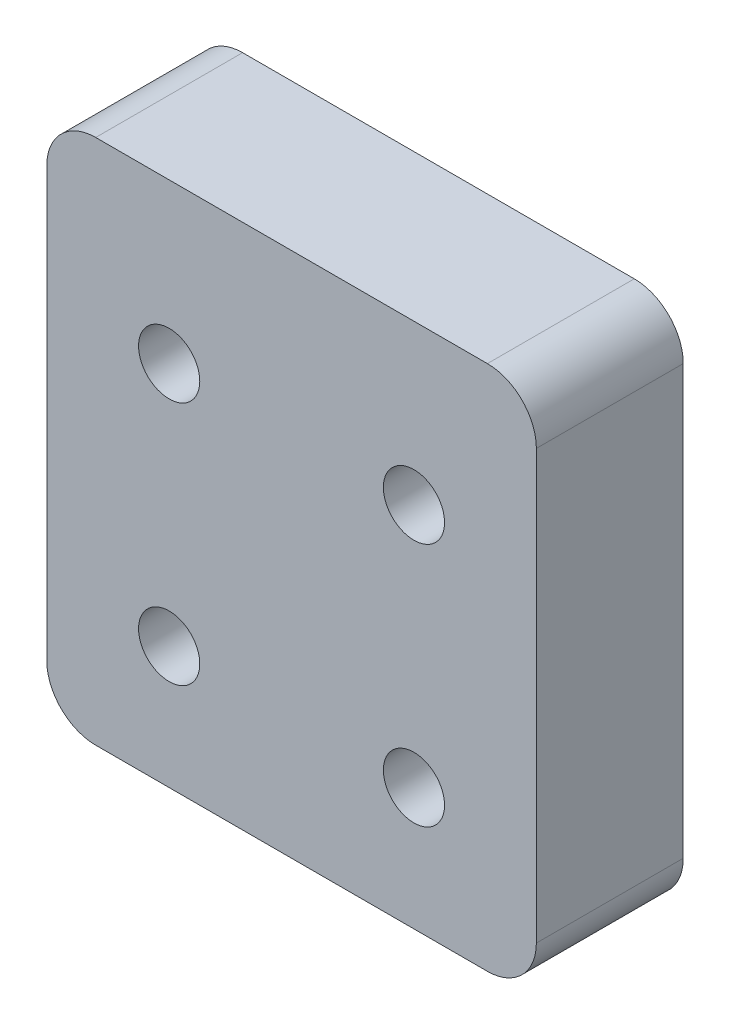
ISO-10303-21;
HEADER;
FILE_DESCRIPTION(('STEP AP214'),'2;1');
FILE_NAME('part.step','',(''),(''),'','','');
FILE_SCHEMA(('AUTOMOTIVE_DESIGN { 1 0 10303 214 1 1 1 1 }'));
ENDSEC;
DATA;
#1=APPLICATION_CONTEXT('core data for automotive mechanical design processes');
#2=APPLICATION_PROTOCOL_DEFINITION('international standard','automotive_design',2000,#1);
#3=PRODUCT_CONTEXT('',#1,'mechanical');
#4=PRODUCT('Part','Part','',(#3));
#5=PRODUCT_RELATED_PRODUCT_CATEGORY('part','',(#4));
#6=PRODUCT_DEFINITION_FORMATION('','',#4);
#7=PRODUCT_DEFINITION_CONTEXT('part definition',#1,'design');
#8=PRODUCT_DEFINITION('design','',#6,#7);
#9=PRODUCT_DEFINITION_SHAPE('','',#8);
#10=(LENGTH_UNIT() NAMED_UNIT(*) SI_UNIT(.MILLI.,.METRE.));
#11=(NAMED_UNIT(*) PLANE_ANGLE_UNIT() SI_UNIT($,.RADIAN.));
#12=(NAMED_UNIT(*) SI_UNIT($,.STERADIAN.) SOLID_ANGLE_UNIT());
#13=UNCERTAINTY_MEASURE_WITH_UNIT(LENGTH_MEASURE(1.E-05),#10,'distance_accuracy_value','');
#14=(GEOMETRIC_REPRESENTATION_CONTEXT(3) GLOBAL_UNCERTAINTY_ASSIGNED_CONTEXT((#13)) GLOBAL_UNIT_ASSIGNED_CONTEXT((#10,
#11,#12)) REPRESENTATION_CONTEXT('',''));
#15=CARTESIAN_POINT('',(0.,0.,0.));
#16=DIRECTION('',(0.,0.,1.));
#17=DIRECTION('',(1.,0.,0.));
#18=AXIS2_PLACEMENT_3D('',#15,#16,#17);
#19=CARTESIAN_POINT('',(0.,0.,12.));
#20=DIRECTION('',(1.,0.,0.));
#21=DIRECTION('',(0.,0.,-1.));
#22=AXIS2_PLACEMENT_3D('',#19,#20,#21);
#23=PLANE('',#22);
#24=DIRECTION('',(0.,-1.,0.));
#25=VECTOR('',#24,1.);
#26=CARTESIAN_POINT('',(0.,0.,0.));
#27=LINE('',#26,#25);
#28=CARTESIAN_POINT('',(0.,39.,0.));
#29=VERTEX_POINT('',#28);
#30=CARTESIAN_POINT('',(0.,4.,0.));
#31=VERTEX_POINT('',#30);
#32=EDGE_CURVE('E157',#29,#31,#27,.T.);
#33=ORIENTED_EDGE('',*,*,#32,.T.);
#34=DIRECTION('',(0.,0.,-1.));
#35=VECTOR('',#34,1.);
#36=CARTESIAN_POINT('',(0.,4.,12.));
#37=LINE('',#36,#35);
#38=CARTESIAN_POINT('',(0.,4.,12.));
#39=VERTEX_POINT('',#38);
#40=EDGE_CURVE('E11',#31,#39,#37,.F.);
#41=ORIENTED_EDGE('',*,*,#40,.T.);
#42=DIRECTION('',(0.,-1.,0.));
#43=VECTOR('',#42,1.);
#44=CARTESIAN_POINT('',(0.,0.,12.));
#45=LINE('',#44,#43);
#46=CARTESIAN_POINT('',(0.,39.,12.));
#47=VERTEX_POINT('',#46);
#48=EDGE_CURVE('E125',#47,#39,#45,.T.);
#49=ORIENTED_EDGE('',*,*,#48,.F.);
#50=DIRECTION('',(0.,0.,-1.));
#51=VECTOR('',#50,1.);
#52=CARTESIAN_POINT('',(0.,39.,12.));
#53=LINE('',#52,#51);
#54=EDGE_CURVE('E41',#47,#29,#53,.T.);
#55=ORIENTED_EDGE('',*,*,#54,.T.);
#56=EDGE_LOOP('',(#33,#41,#49,#55));
#57=FACE_BOUND('',#56,.T.);
#58=ADVANCED_FACE('F33',(#57),#23,.F.);
#59=CARTESIAN_POINT('',(0.,0.,12.));
#60=DIRECTION('',(0.,1.,0.));
#61=DIRECTION('',(0.,0.,1.));
#62=AXIS2_PLACEMENT_3D('',#59,#60,#61);
#63=PLANE('',#62);
#64=DIRECTION('',(1.,0.,0.));
#65=VECTOR('',#64,1.);
#66=CARTESIAN_POINT('',(0.,0.,0.));
#67=LINE('',#66,#65);
#68=CARTESIAN_POINT('',(4.,0.,0.));
#69=VERTEX_POINT('',#68);
#70=CARTESIAN_POINT('',(36.,0.,0.));
#71=VERTEX_POINT('',#70);
#72=EDGE_CURVE('E130',#69,#71,#67,.T.);
#73=ORIENTED_EDGE('',*,*,#72,.T.);
#74=DIRECTION('',(0.,0.,-1.));
#75=VECTOR('',#74,1.);
#76=CARTESIAN_POINT('',(36.,0.,12.));
#77=LINE('',#76,#75);
#78=CARTESIAN_POINT('',(36.,0.,12.));
#79=VERTEX_POINT('',#78);
#80=EDGE_CURVE('E48',#71,#79,#77,.F.);
#81=ORIENTED_EDGE('',*,*,#80,.T.);
#82=DIRECTION('',(1.,0.,0.));
#83=VECTOR('',#82,1.);
#84=CARTESIAN_POINT('',(0.,0.,12.));
#85=LINE('',#84,#83);
#86=CARTESIAN_POINT('',(4.,0.,12.));
#87=VERTEX_POINT('',#86);
#88=EDGE_CURVE('E128',#87,#79,#85,.T.);
#89=ORIENTED_EDGE('',*,*,#88,.F.);
#90=DIRECTION('',(0.,0.,-1.));
#91=VECTOR('',#90,1.);
#92=CARTESIAN_POINT('',(4.,0.,12.));
#93=LINE('',#92,#91);
#94=EDGE_CURVE('E149',#87,#69,#93,.T.);
#95=ORIENTED_EDGE('',*,*,#94,.T.);
#96=EDGE_LOOP('',(#73,#81,#89,#95));
#97=FACE_BOUND('',#96,.T.);
#98=ADVANCED_FACE('F219',(#97),#63,.F.);
#99=CARTESIAN_POINT('',(40.,0.,12.));
#100=DIRECTION('',(-1.,0.,0.));
#101=DIRECTION('',(0.,0.,1.));
#102=AXIS2_PLACEMENT_3D('',#99,#100,#101);
#103=PLANE('',#102);
#104=DIRECTION('',(0.,1.,0.));
#105=VECTOR('',#104,1.);
#106=CARTESIAN_POINT('',(40.,0.,0.));
#107=LINE('',#106,#105);
#108=CARTESIAN_POINT('',(40.,4.,0.));
#109=VERTEX_POINT('',#108);
#110=CARTESIAN_POINT('',(40.,39.,0.));
#111=VERTEX_POINT('',#110);
#112=EDGE_CURVE('E126',#109,#111,#107,.T.);
#113=ORIENTED_EDGE('',*,*,#112,.T.);
#114=DIRECTION('',(0.,0.,-1.));
#115=VECTOR('',#114,1.);
#116=CARTESIAN_POINT('',(40.,39.,12.));
#117=LINE('',#116,#115);
#118=CARTESIAN_POINT('',(40.,39.,12.));
#119=VERTEX_POINT('',#118);
#120=EDGE_CURVE('E104',#111,#119,#117,.F.);
#121=ORIENTED_EDGE('',*,*,#120,.T.);
#122=DIRECTION('',(0.,1.,0.));
#123=VECTOR('',#122,1.);
#124=CARTESIAN_POINT('',(40.,0.,12.));
#125=LINE('',#124,#123);
#126=CARTESIAN_POINT('',(40.,4.,12.));
#127=VERTEX_POINT('',#126);
#128=EDGE_CURVE('E169',#127,#119,#125,.T.);
#129=ORIENTED_EDGE('',*,*,#128,.F.);
#130=DIRECTION('',(0.,0.,-1.));
#131=VECTOR('',#130,1.);
#132=CARTESIAN_POINT('',(40.,4.,12.));
#133=LINE('',#132,#131);
#134=EDGE_CURVE('E109',#127,#109,#133,.T.);
#135=ORIENTED_EDGE('',*,*,#134,.T.);
#136=EDGE_LOOP('',(#113,#121,#129,#135));
#137=FACE_BOUND('',#136,.T.);
#138=ADVANCED_FACE('F216',(#137),#103,.F.);
#139=CARTESIAN_POINT('',(0.,43.,12.));
#140=DIRECTION('',(0.,-1.,0.));
#141=DIRECTION('',(0.,0.,-1.));
#142=AXIS2_PLACEMENT_3D('',#139,#140,#141);
#143=PLANE('',#142);
#144=DIRECTION('',(-1.,0.,0.));
#145=VECTOR('',#144,1.);
#146=CARTESIAN_POINT('',(0.,43.,12.));
#147=LINE('',#146,#145);
#148=CARTESIAN_POINT('',(36.,43.,12.));
#149=VERTEX_POINT('',#148);
#150=CARTESIAN_POINT('',(4.,43.,12.));
#151=VERTEX_POINT('',#150);
#152=EDGE_CURVE('E119',#149,#151,#147,.T.);
#153=ORIENTED_EDGE('',*,*,#152,.F.);
#154=DIRECTION('',(0.,0.,-1.));
#155=VECTOR('',#154,1.);
#156=CARTESIAN_POINT('',(36.,43.,12.));
#157=LINE('',#156,#155);
#158=CARTESIAN_POINT('',(36.,43.,0.));
#159=VERTEX_POINT('',#158);
#160=EDGE_CURVE('E103',#149,#159,#157,.T.);
#161=ORIENTED_EDGE('',*,*,#160,.T.);
#162=DIRECTION('',(-1.,0.,0.));
#163=VECTOR('',#162,1.);
#164=CARTESIAN_POINT('',(0.,43.,0.));
#165=LINE('',#164,#163);
#166=CARTESIAN_POINT('',(4.,43.,0.));
#167=VERTEX_POINT('',#166);
#168=EDGE_CURVE('E116',#159,#167,#165,.T.);
#169=ORIENTED_EDGE('',*,*,#168,.T.);
#170=DIRECTION('',(0.,0.,-1.));
#171=VECTOR('',#170,1.);
#172=CARTESIAN_POINT('',(4.,43.,12.));
#173=LINE('',#172,#171);
#174=EDGE_CURVE('E121',#167,#151,#173,.F.);
#175=ORIENTED_EDGE('',*,*,#174,.T.);
#176=EDGE_LOOP('',(#153,#161,#169,#175));
#177=FACE_BOUND('',#176,.T.);
#178=ADVANCED_FACE('F115',(#177),#143,.F.);
#179=CARTESIAN_POINT('',(0.,0.,12.));
#180=DIRECTION('',(0.,0.,-1.));
#181=DIRECTION('',(-1.,0.,0.));
#182=AXIS2_PLACEMENT_3D('',#179,#180,#181);
#183=PLANE('',#182);
#184=CARTESIAN_POINT('',(10.,10.,12.));
#185=DIRECTION('',(0.,0.,1.));
#186=DIRECTION('',(-1.,0.,0.));
#187=AXIS2_PLACEMENT_3D('',#184,#185,#186);
#188=CIRCLE('',#187,2.5);
#189=CARTESIAN_POINT('',(7.5,10.,12.));
#190=VERTEX_POINT('',#189);
#191=EDGE_CURVE('E188',#190,#190,#188,.T.);
#192=ORIENTED_EDGE('',*,*,#191,.F.);
#193=EDGE_LOOP('',(#192));
#194=FACE_BOUND('',#193,.T.);
#195=CARTESIAN_POINT('',(30.,10.,12.));
#196=DIRECTION('',(0.,0.,1.));
#197=DIRECTION('',(1.,0.,0.));
#198=AXIS2_PLACEMENT_3D('',#195,#196,#197);
#199=CIRCLE('',#198,2.50000000000001);
#200=CARTESIAN_POINT('',(32.5,10.,12.));
#201=VERTEX_POINT('',#200);
#202=EDGE_CURVE('E182',#201,#201,#199,.T.);
#203=ORIENTED_EDGE('',*,*,#202,.F.);
#204=EDGE_LOOP('',(#203));
#205=FACE_BOUND('',#204,.T.);
#206=CARTESIAN_POINT('',(30.,30.,12.));
#207=DIRECTION('',(0.,0.,1.));
#208=DIRECTION('',(-1.,0.,0.));
#209=AXIS2_PLACEMENT_3D('',#206,#207,#208);
#210=CIRCLE('',#209,2.50000000000001);
#211=CARTESIAN_POINT('',(27.5,30.,12.));
#212=VERTEX_POINT('',#211);
#213=EDGE_CURVE('E176',#212,#212,#210,.T.);
#214=ORIENTED_EDGE('',*,*,#213,.F.);
#215=EDGE_LOOP('',(#214));
#216=FACE_BOUND('',#215,.T.);
#217=CARTESIAN_POINT('',(10.,30.,12.));
#218=DIRECTION('',(0.,0.,1.));
#219=DIRECTION('',(1.,0.,0.));
#220=AXIS2_PLACEMENT_3D('',#217,#218,#219);
#221=CIRCLE('',#220,2.5);
#222=CARTESIAN_POINT('',(12.5,30.,12.));
#223=VERTEX_POINT('',#222);
#224=EDGE_CURVE('E165',#223,#223,#221,.T.);
#225=ORIENTED_EDGE('',*,*,#224,.F.);
#226=EDGE_LOOP('',(#225));
#227=FACE_BOUND('',#226,.T.);
#228=ORIENTED_EDGE('',*,*,#128,.T.);
#229=CARTESIAN_POINT('',(36.,39.,12.));
#230=DIRECTION('',(0.,0.,-1.));
#231=DIRECTION('',(-1.,0.,0.));
#232=AXIS2_PLACEMENT_3D('',#229,#230,#231);
#233=CIRCLE('',#232,4.);
#234=EDGE_CURVE('E147',#119,#149,#233,.F.);
#235=ORIENTED_EDGE('',*,*,#234,.T.);
#236=ORIENTED_EDGE('',*,*,#152,.T.);
#237=CARTESIAN_POINT('',(4.,39.,12.));
#238=DIRECTION('',(0.,0.,-1.));
#239=DIRECTION('',(-1.,0.,0.));
#240=AXIS2_PLACEMENT_3D('',#237,#238,#239);
#241=CIRCLE('',#240,4.);
#242=EDGE_CURVE('E142',#151,#47,#241,.F.);
#243=ORIENTED_EDGE('',*,*,#242,.T.);
#244=ORIENTED_EDGE('',*,*,#48,.T.);
#245=CARTESIAN_POINT('',(4.,4.,12.));
#246=DIRECTION('',(0.,0.,-1.));
#247=DIRECTION('',(-1.,0.,0.));
#248=AXIS2_PLACEMENT_3D('',#245,#246,#247);
#249=CIRCLE('',#248,4.);
#250=EDGE_CURVE('E55',#39,#87,#249,.F.);
#251=ORIENTED_EDGE('',*,*,#250,.T.);
#252=ORIENTED_EDGE('',*,*,#88,.T.);
#253=CARTESIAN_POINT('',(36.,4.,12.));
#254=DIRECTION('',(0.,0.,-1.));
#255=DIRECTION('',(-1.,0.,0.));
#256=AXIS2_PLACEMENT_3D('',#253,#254,#255);
#257=CIRCLE('',#256,4.);
#258=EDGE_CURVE('E145',#79,#127,#257,.F.);
#259=ORIENTED_EDGE('',*,*,#258,.T.);
#260=EDGE_LOOP('',(#228,#235,#236,#243,#244,#251,#252,#259));
#261=FACE_BOUND('',#260,.T.);
#262=ADVANCED_FACE('F203',(#194,#205,#216,#227,#261),#183,.F.);
#263=CARTESIAN_POINT('',(0.,0.,0.));
#264=DIRECTION('',(0.,0.,-1.));
#265=DIRECTION('',(-1.,0.,0.));
#266=AXIS2_PLACEMENT_3D('',#263,#264,#265);
#267=PLANE('',#266);
#268=CARTESIAN_POINT('',(10.,10.,0.));
#269=DIRECTION('',(0.,0.,1.));
#270=DIRECTION('',(-1.,0.,0.));
#271=AXIS2_PLACEMENT_3D('',#268,#269,#270);
#272=CIRCLE('',#271,2.5);
#273=CARTESIAN_POINT('',(7.5,10.,0.));
#274=VERTEX_POINT('',#273);
#275=EDGE_CURVE('E174',#274,#274,#272,.T.);
#276=ORIENTED_EDGE('',*,*,#275,.T.);
#277=EDGE_LOOP('',(#276));
#278=FACE_BOUND('',#277,.T.);
#279=CARTESIAN_POINT('',(30.,10.,0.));
#280=DIRECTION('',(0.,0.,1.));
#281=DIRECTION('',(1.,0.,0.));
#282=AXIS2_PLACEMENT_3D('',#279,#280,#281);
#283=CIRCLE('',#282,2.50000000000001);
#284=CARTESIAN_POINT('',(32.5,10.,0.));
#285=VERTEX_POINT('',#284);
#286=EDGE_CURVE('E185',#285,#285,#283,.T.);
#287=ORIENTED_EDGE('',*,*,#286,.T.);
#288=EDGE_LOOP('',(#287));
#289=FACE_BOUND('',#288,.T.);
#290=CARTESIAN_POINT('',(30.,30.,0.));
#291=DIRECTION('',(0.,0.,1.));
#292=DIRECTION('',(-1.,0.,0.));
#293=AXIS2_PLACEMENT_3D('',#290,#291,#292);
#294=CIRCLE('',#293,2.50000000000001);
#295=CARTESIAN_POINT('',(27.5,30.,0.));
#296=VERTEX_POINT('',#295);
#297=EDGE_CURVE('E179',#296,#296,#294,.T.);
#298=ORIENTED_EDGE('',*,*,#297,.T.);
#299=EDGE_LOOP('',(#298));
#300=FACE_BOUND('',#299,.T.);
#301=CARTESIAN_POINT('',(10.,30.,0.));
#302=DIRECTION('',(0.,0.,1.));
#303=DIRECTION('',(1.,0.,0.));
#304=AXIS2_PLACEMENT_3D('',#301,#302,#303);
#305=CIRCLE('',#304,2.5);
#306=CARTESIAN_POINT('',(12.5,30.,0.));
#307=VERTEX_POINT('',#306);
#308=EDGE_CURVE('E162',#307,#307,#305,.T.);
#309=ORIENTED_EDGE('',*,*,#308,.T.);
#310=EDGE_LOOP('',(#309));
#311=FACE_BOUND('',#310,.T.);
#312=ORIENTED_EDGE('',*,*,#168,.F.);
#313=CARTESIAN_POINT('',(36.,39.,0.));
#314=DIRECTION('',(0.,0.,-1.));
#315=DIRECTION('',(-1.,0.,0.));
#316=AXIS2_PLACEMENT_3D('',#313,#314,#315);
#317=CIRCLE('',#316,4.);
#318=EDGE_CURVE('E99',#159,#111,#317,.T.);
#319=ORIENTED_EDGE('',*,*,#318,.T.);
#320=ORIENTED_EDGE('',*,*,#112,.F.);
#321=CARTESIAN_POINT('',(36.,4.,0.));
#322=DIRECTION('',(0.,0.,-1.));
#323=DIRECTION('',(-1.,0.,0.));
#324=AXIS2_PLACEMENT_3D('',#321,#322,#323);
#325=CIRCLE('',#324,4.);
#326=EDGE_CURVE('E110',#109,#71,#325,.T.);
#327=ORIENTED_EDGE('',*,*,#326,.T.);
#328=ORIENTED_EDGE('',*,*,#72,.F.);
#329=CARTESIAN_POINT('',(4.,4.,0.));
#330=DIRECTION('',(0.,0.,-1.));
#331=DIRECTION('',(-1.,0.,0.));
#332=AXIS2_PLACEMENT_3D('',#329,#330,#331);
#333=CIRCLE('',#332,4.);
#334=EDGE_CURVE('E136',#69,#31,#333,.T.);
#335=ORIENTED_EDGE('',*,*,#334,.T.);
#336=ORIENTED_EDGE('',*,*,#32,.F.);
#337=CARTESIAN_POINT('',(4.,39.,0.));
#338=DIRECTION('',(0.,0.,-1.));
#339=DIRECTION('',(-1.,0.,0.));
#340=AXIS2_PLACEMENT_3D('',#337,#338,#339);
#341=CIRCLE('',#340,4.);
#342=EDGE_CURVE('E120',#29,#167,#341,.T.);
#343=ORIENTED_EDGE('',*,*,#342,.T.);
#344=EDGE_LOOP('',(#312,#319,#320,#327,#328,#335,#336,#343));
#345=FACE_BOUND('',#344,.T.);
#346=ADVANCED_FACE('F123',(#278,#289,#300,#311,#345),#267,.T.);
#347=CARTESIAN_POINT('',(10.,30.,0.));
#348=DIRECTION('',(0.,0.,1.));
#349=DIRECTION('',(1.,0.,0.));
#350=AXIS2_PLACEMENT_3D('',#347,#348,#349);
#351=CYLINDRICAL_SURFACE('',#350,2.5);
#352=ORIENTED_EDGE('',*,*,#308,.F.);
#353=EDGE_LOOP('',(#352));
#354=FACE_BOUND('',#353,.T.);
#355=ORIENTED_EDGE('',*,*,#224,.T.);
#356=EDGE_LOOP('',(#355));
#357=FACE_BOUND('',#356,.T.);
#358=ADVANCED_FACE('F281',(#354,#357),#351,.F.);
#359=CARTESIAN_POINT('',(30.,30.,0.));
#360=DIRECTION('',(0.,0.,1.));
#361=DIRECTION('',(1.,0.,0.));
#362=AXIS2_PLACEMENT_3D('',#359,#360,#361);
#363=CYLINDRICAL_SURFACE('',#362,2.50000000000001);
#364=ORIENTED_EDGE('',*,*,#297,.F.);
#365=EDGE_LOOP('',(#364));
#366=FACE_BOUND('',#365,.T.);
#367=ORIENTED_EDGE('',*,*,#213,.T.);
#368=EDGE_LOOP('',(#367));
#369=FACE_BOUND('',#368,.T.);
#370=ADVANCED_FACE('F272',(#366,#369),#363,.F.);
#371=CARTESIAN_POINT('',(30.,10.,0.));
#372=DIRECTION('',(0.,0.,1.));
#373=DIRECTION('',(1.,0.,0.));
#374=AXIS2_PLACEMENT_3D('',#371,#372,#373);
#375=CYLINDRICAL_SURFACE('',#374,2.50000000000001);
#376=ORIENTED_EDGE('',*,*,#286,.F.);
#377=EDGE_LOOP('',(#376));
#378=FACE_BOUND('',#377,.T.);
#379=ORIENTED_EDGE('',*,*,#202,.T.);
#380=EDGE_LOOP('',(#379));
#381=FACE_BOUND('',#380,.T.);
#382=ADVANCED_FACE('F199',(#378,#381),#375,.F.);
#383=CARTESIAN_POINT('',(10.,10.,0.));
#384=DIRECTION('',(0.,0.,1.));
#385=DIRECTION('',(1.,0.,0.));
#386=AXIS2_PLACEMENT_3D('',#383,#384,#385);
#387=CYLINDRICAL_SURFACE('',#386,2.5);
#388=ORIENTED_EDGE('',*,*,#275,.F.);
#389=EDGE_LOOP('',(#388));
#390=FACE_BOUND('',#389,.T.);
#391=ORIENTED_EDGE('',*,*,#191,.T.);
#392=EDGE_LOOP('',(#391));
#393=FACE_BOUND('',#392,.T.);
#394=ADVANCED_FACE('F196',(#390,#393),#387,.F.);
#395=CARTESIAN_POINT('',(36.,39.,12.));
#396=DIRECTION('',(0.,0.,-1.));
#397=DIRECTION('',(-1.,0.,0.));
#398=AXIS2_PLACEMENT_3D('',#395,#396,#397);
#399=CYLINDRICAL_SURFACE('',#398,4.);
#400=ORIENTED_EDGE('',*,*,#234,.F.);
#401=ORIENTED_EDGE('',*,*,#120,.F.);
#402=ORIENTED_EDGE('',*,*,#318,.F.);
#403=ORIENTED_EDGE('',*,*,#160,.F.);
#404=EDGE_LOOP('',(#400,#401,#402,#403));
#405=FACE_BOUND('',#404,.T.);
#406=ADVANCED_FACE('F102',(#405),#399,.T.);
#407=CARTESIAN_POINT('',(36.,4.,12.));
#408=DIRECTION('',(0.,0.,-1.));
#409=DIRECTION('',(-1.,0.,0.));
#410=AXIS2_PLACEMENT_3D('',#407,#408,#409);
#411=CYLINDRICAL_SURFACE('',#410,4.);
#412=ORIENTED_EDGE('',*,*,#258,.F.);
#413=ORIENTED_EDGE('',*,*,#80,.F.);
#414=ORIENTED_EDGE('',*,*,#326,.F.);
#415=ORIENTED_EDGE('',*,*,#134,.F.);
#416=EDGE_LOOP('',(#412,#413,#414,#415));
#417=FACE_BOUND('',#416,.T.);
#418=ADVANCED_FACE('F218',(#417),#411,.T.);
#419=CARTESIAN_POINT('',(4.,4.,12.));
#420=DIRECTION('',(0.,0.,-1.));
#421=DIRECTION('',(-1.,0.,0.));
#422=AXIS2_PLACEMENT_3D('',#419,#420,#421);
#423=CYLINDRICAL_SURFACE('',#422,4.);
#424=ORIENTED_EDGE('',*,*,#250,.F.);
#425=ORIENTED_EDGE('',*,*,#40,.F.);
#426=ORIENTED_EDGE('',*,*,#334,.F.);
#427=ORIENTED_EDGE('',*,*,#94,.F.);
#428=EDGE_LOOP('',(#424,#425,#426,#427));
#429=FACE_BOUND('',#428,.T.);
#430=ADVANCED_FACE('F222',(#429),#423,.T.);
#431=CARTESIAN_POINT('',(4.,39.,12.));
#432=DIRECTION('',(0.,0.,-1.));
#433=DIRECTION('',(-1.,0.,0.));
#434=AXIS2_PLACEMENT_3D('',#431,#432,#433);
#435=CYLINDRICAL_SURFACE('',#434,4.);
#436=ORIENTED_EDGE('',*,*,#242,.F.);
#437=ORIENTED_EDGE('',*,*,#174,.F.);
#438=ORIENTED_EDGE('',*,*,#342,.F.);
#439=ORIENTED_EDGE('',*,*,#54,.F.);
#440=EDGE_LOOP('',(#436,#437,#438,#439));
#441=FACE_BOUND('',#440,.T.);
#442=ADVANCED_FACE('F35',(#441),#435,.T.);
#443=CLOSED_SHELL('',(#58,#98,#138,#178,#262,#346,#358,#370,#382,#394,#406,#418,#430,#442));
#444=MANIFOLD_SOLID_BREP('B2',#443);
#445=ADVANCED_BREP_SHAPE_REPRESENTATION('',(#18,#444),#14);
#446=SHAPE_DEFINITION_REPRESENTATION(#9,#445);
ENDSEC;
END-ISO-10303-21;
